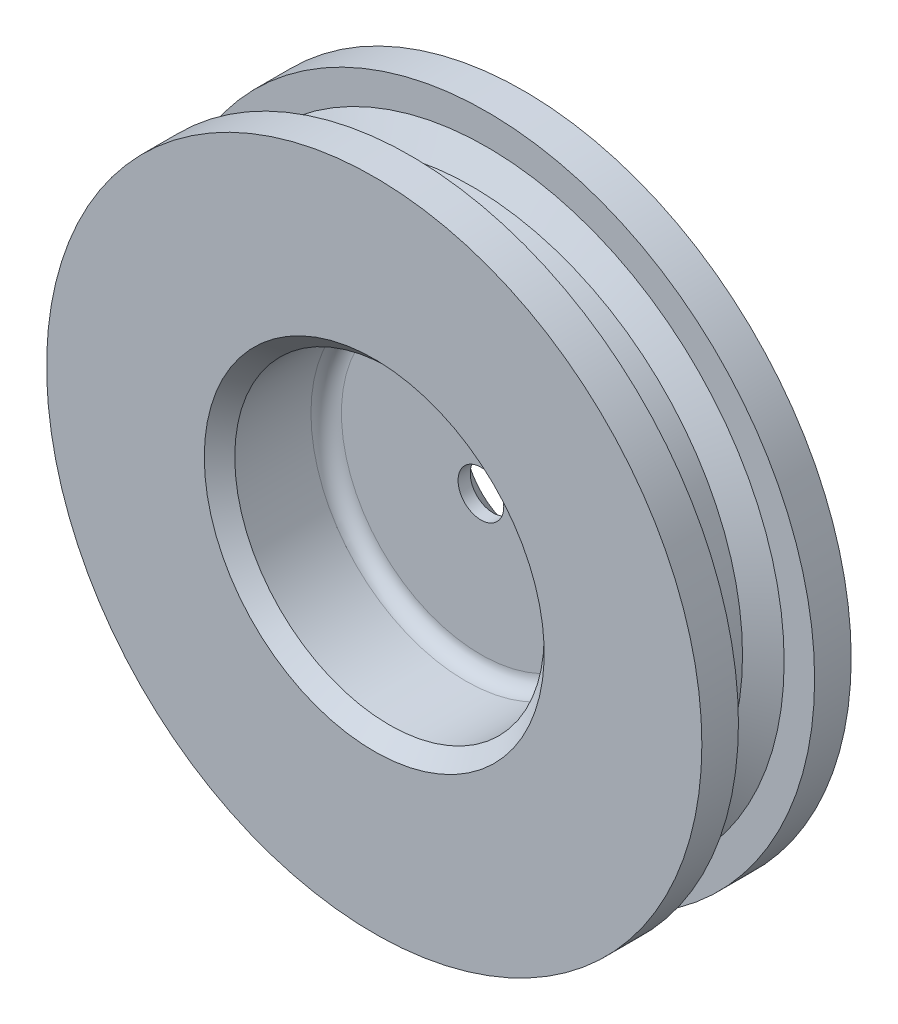
ISO-10303-21;
HEADER;
FILE_DESCRIPTION(('STEP AP214'),'2;1');
FILE_NAME('part.step','',(''),(''),'','','');
FILE_SCHEMA(('AUTOMOTIVE_DESIGN { 1 0 10303 214 1 1 1 1 }'));
ENDSEC;
DATA;
#1=APPLICATION_CONTEXT('core data for automotive mechanical design processes');
#2=APPLICATION_PROTOCOL_DEFINITION('international standard','automotive_design',2000,#1);
#3=PRODUCT_CONTEXT('',#1,'mechanical');
#4=PRODUCT('Part','Part','',(#3));
#5=PRODUCT_RELATED_PRODUCT_CATEGORY('part','',(#4));
#6=PRODUCT_DEFINITION_FORMATION('','',#4);
#7=PRODUCT_DEFINITION_CONTEXT('part definition',#1,'design');
#8=PRODUCT_DEFINITION('design','',#6,#7);
#9=PRODUCT_DEFINITION_SHAPE('','',#8);
#10=(LENGTH_UNIT() NAMED_UNIT(*) SI_UNIT(.MILLI.,.METRE.));
#11=(NAMED_UNIT(*) PLANE_ANGLE_UNIT() SI_UNIT($,.RADIAN.));
#12=(NAMED_UNIT(*) SI_UNIT($,.STERADIAN.) SOLID_ANGLE_UNIT());
#13=UNCERTAINTY_MEASURE_WITH_UNIT(LENGTH_MEASURE(1.E-05),#10,'distance_accuracy_value','');
#14=(GEOMETRIC_REPRESENTATION_CONTEXT(3) GLOBAL_UNCERTAINTY_ASSIGNED_CONTEXT((#13)) GLOBAL_UNIT_ASSIGNED_CONTEXT((#10,
#11,#12)) REPRESENTATION_CONTEXT('',''));
#15=CARTESIAN_POINT('',(0.,0.,0.));
#16=DIRECTION('',(0.,0.,1.));
#17=DIRECTION('',(1.,0.,0.));
#18=AXIS2_PLACEMENT_3D('',#15,#16,#17);
#19=CARTESIAN_POINT('',(0.,-1.5,9.05826702392601));
#20=DIRECTION('',(0.,0.,1.));
#21=DIRECTION('',(1.,0.,0.));
#22=AXIS2_PLACEMENT_3D('',#19,#20,#21);
#23=CYLINDRICAL_SURFACE('',#22,1.5);
#24=CARTESIAN_POINT('',(0.,-1.5,-2.89999999999999));
#25=DIRECTION('',(0.,0.,1.));
#26=DIRECTION('',(1.,0.,0.));
#27=AXIS2_PLACEMENT_3D('',#24,#25,#26);
#28=CIRCLE('',#27,1.5);
#29=CARTESIAN_POINT('',(1.5,-1.5,-2.89999999999999));
#30=VERTEX_POINT('',#29);
#31=EDGE_CURVE('E10',#30,#30,#28,.F.);
#32=ORIENTED_EDGE('',*,*,#31,.T.);
#33=EDGE_LOOP('',(#32));
#34=FACE_BOUND('',#33,.T.);
#35=CARTESIAN_POINT('',(0.,-1.5,-2.1));
#36=DIRECTION('',(0.,0.,1.));
#37=DIRECTION('',(1.,0.,0.));
#38=AXIS2_PLACEMENT_3D('',#35,#36,#37);
#39=CIRCLE('',#38,1.5);
#40=CARTESIAN_POINT('',(1.5,-1.5,-2.1));
#41=VERTEX_POINT('',#40);
#42=EDGE_CURVE('E77',#41,#41,#39,.F.);
#43=ORIENTED_EDGE('',*,*,#42,.F.);
#44=EDGE_LOOP('',(#43));
#45=FACE_BOUND('',#44,.T.);
#46=ADVANCED_FACE('F43',(#34,#45),#23,.F.);
#47=CARTESIAN_POINT('',(0.,0.,4.9));
#48=DIRECTION('',(0.,0.,-1.));
#49=DIRECTION('',(-1.,0.,0.));
#50=AXIS2_PLACEMENT_3D('',#47,#48,#49);
#51=PLANE('',#50);
#52=CARTESIAN_POINT('',(0.,-1.5,4.9));
#53=DIRECTION('',(0.,0.,-1.));
#54=DIRECTION('',(-1.,0.,0.));
#55=AXIS2_PLACEMENT_3D('',#52,#53,#54);
#56=CIRCLE('',#55,11.1538993275223);
#57=CARTESIAN_POINT('',(-11.1538993275223,-1.5,4.9));
#58=VERTEX_POINT('',#57);
#59=EDGE_CURVE('E68',#58,#58,#56,.T.);
#60=ORIENTED_EDGE('',*,*,#59,.T.);
#61=EDGE_LOOP('',(#60));
#62=FACE_BOUND('',#61,.T.);
#63=CARTESIAN_POINT('',(0.,-1.5,4.9));
#64=DIRECTION('',(0.,0.,1.));
#65=DIRECTION('',(1.,0.,0.));
#66=AXIS2_PLACEMENT_3D('',#63,#64,#65);
#67=CIRCLE('',#66,21.5);
#68=CARTESIAN_POINT('',(21.5,-1.5,4.9));
#69=VERTEX_POINT('',#68);
#70=EDGE_CURVE('E76',#69,#69,#67,.T.);
#71=ORIENTED_EDGE('',*,*,#70,.T.);
#72=EDGE_LOOP('',(#71));
#73=FACE_BOUND('',#72,.T.);
#74=ADVANCED_FACE('F131',(#62,#73),#51,.F.);
#75=CARTESIAN_POINT('',(0.,-1.5,9.05826702392601));
#76=DIRECTION('',(0.,0.,1.));
#77=DIRECTION('',(1.,0.,0.));
#78=AXIS2_PLACEMENT_3D('',#75,#76,#77);
#79=CYLINDRICAL_SURFACE('',#78,21.5);
#80=ORIENTED_EDGE('',*,*,#70,.F.);
#81=EDGE_LOOP('',(#80));
#82=FACE_BOUND('',#81,.T.);
#83=CARTESIAN_POINT('',(0.,-1.5,2.5));
#84=DIRECTION('',(0.,0.,1.));
#85=DIRECTION('',(1.,0.,0.));
#86=AXIS2_PLACEMENT_3D('',#83,#84,#85);
#87=CIRCLE('',#86,21.5);
#88=CARTESIAN_POINT('',(21.5,-1.5,2.5));
#89=VERTEX_POINT('',#88);
#90=EDGE_CURVE('E85',#89,#89,#87,.T.);
#91=ORIENTED_EDGE('',*,*,#90,.T.);
#92=EDGE_LOOP('',(#91));
#93=FACE_BOUND('',#92,.T.);
#94=ADVANCED_FACE('F136',(#82,#93),#79,.T.);
#95=CARTESIAN_POINT('',(0.,20.,2.5));
#96=DIRECTION('',(0.,0.,1.));
#97=DIRECTION('',(1.,0.,0.));
#98=AXIS2_PLACEMENT_3D('',#95,#96,#97);
#99=PLANE('',#98);
#100=ORIENTED_EDGE('',*,*,#90,.F.);
#101=EDGE_LOOP('',(#100));
#102=FACE_BOUND('',#101,.T.);
#103=CARTESIAN_POINT('',(0.,-1.5,2.5));
#104=DIRECTION('',(0.,0.,1.));
#105=DIRECTION('',(1.,0.,0.));
#106=AXIS2_PLACEMENT_3D('',#103,#104,#105);
#107=CIRCLE('',#106,19.5);
#108=CARTESIAN_POINT('',(19.5,-1.5,2.5));
#109=VERTEX_POINT('',#108);
#110=EDGE_CURVE('E89',#109,#109,#107,.T.);
#111=ORIENTED_EDGE('',*,*,#110,.T.);
#112=EDGE_LOOP('',(#111));
#113=FACE_BOUND('',#112,.T.);
#114=ADVANCED_FACE('F259',(#102,#113),#99,.F.);
#115=CARTESIAN_POINT('',(0.,-1.5,1.5));
#116=DIRECTION('',(0.,0.,1.));
#117=DIRECTION('',(1.,0.,0.));
#118=AXIS2_PLACEMENT_3D('',#115,#116,#117);
#119=CONICAL_SURFACE('',#118,17.7679491924311,1.0471975511966);
#120=ORIENTED_EDGE('',*,*,#110,.F.);
#121=EDGE_LOOP('',(#120));
#122=FACE_BOUND('',#121,.T.);
#123=CARTESIAN_POINT('',(0.,-1.5,1.5));
#124=DIRECTION('',(0.,0.,1.));
#125=DIRECTION('',(1.,0.,0.));
#126=AXIS2_PLACEMENT_3D('',#123,#124,#125);
#127=CIRCLE('',#126,17.7679491924311);
#128=CARTESIAN_POINT('',(17.7679491924311,-1.5,1.5));
#129=VERTEX_POINT('',#128);
#130=EDGE_CURVE('E93',#129,#129,#127,.T.);
#131=ORIENTED_EDGE('',*,*,#130,.T.);
#132=EDGE_LOOP('',(#131));
#133=FACE_BOUND('',#132,.T.);
#134=ADVANCED_FACE('F250',(#122,#133),#119,.T.);
#135=CARTESIAN_POINT('',(0.,-1.5,9.05826702392601));
#136=DIRECTION('',(0.,0.,1.));
#137=DIRECTION('',(1.,0.,0.));
#138=AXIS2_PLACEMENT_3D('',#135,#136,#137);
#139=CYLINDRICAL_SURFACE('',#138,17.7679491924311);
#140=ORIENTED_EDGE('',*,*,#130,.F.);
#141=EDGE_LOOP('',(#140));
#142=FACE_BOUND('',#141,.T.);
#143=CARTESIAN_POINT('',(0.,-1.5,-1.5));
#144=DIRECTION('',(0.,0.,1.));
#145=DIRECTION('',(1.,0.,0.));
#146=AXIS2_PLACEMENT_3D('',#143,#144,#145);
#147=CIRCLE('',#146,17.7679491924311);
#148=CARTESIAN_POINT('',(17.7679491924311,-1.5,-1.5));
#149=VERTEX_POINT('',#148);
#150=EDGE_CURVE('E97',#149,#149,#147,.T.);
#151=ORIENTED_EDGE('',*,*,#150,.T.);
#152=EDGE_LOOP('',(#151));
#153=FACE_BOUND('',#152,.T.);
#154=ADVANCED_FACE('F239',(#142,#153),#139,.T.);
#155=CARTESIAN_POINT('',(0.,-1.5,-2.5));
#156=DIRECTION('',(0.,0.,-1.));
#157=DIRECTION('',(-1.,0.,0.));
#158=AXIS2_PLACEMENT_3D('',#155,#156,#157);
#159=CONICAL_SURFACE('',#158,19.5,1.0471975511966);
#160=ORIENTED_EDGE('',*,*,#150,.F.);
#161=EDGE_LOOP('',(#160));
#162=FACE_BOUND('',#161,.T.);
#163=CARTESIAN_POINT('',(0.,-1.5,-2.5));
#164=DIRECTION('',(0.,0.,1.));
#165=DIRECTION('',(1.,0.,0.));
#166=AXIS2_PLACEMENT_3D('',#163,#164,#165);
#167=CIRCLE('',#166,19.5);
#168=CARTESIAN_POINT('',(19.5,-1.5,-2.5));
#169=VERTEX_POINT('',#168);
#170=EDGE_CURVE('E101',#169,#169,#167,.T.);
#171=ORIENTED_EDGE('',*,*,#170,.T.);
#172=EDGE_LOOP('',(#171));
#173=FACE_BOUND('',#172,.T.);
#174=ADVANCED_FACE('F229',(#162,#173),#159,.T.);
#175=CARTESIAN_POINT('',(0.,20.,-2.5));
#176=DIRECTION('',(0.,0.,-1.));
#177=DIRECTION('',(-1.,0.,0.));
#178=AXIS2_PLACEMENT_3D('',#175,#176,#177);
#179=PLANE('',#178);
#180=ORIENTED_EDGE('',*,*,#170,.F.);
#181=EDGE_LOOP('',(#180));
#182=FACE_BOUND('',#181,.T.);
#183=CARTESIAN_POINT('',(0.,-1.5,-2.5));
#184=DIRECTION('',(0.,0.,1.));
#185=DIRECTION('',(1.,0.,0.));
#186=AXIS2_PLACEMENT_3D('',#183,#184,#185);
#187=CIRCLE('',#186,21.5);
#188=CARTESIAN_POINT('',(21.5,-1.5,-2.5));
#189=VERTEX_POINT('',#188);
#190=EDGE_CURVE('E105',#189,#189,#187,.T.);
#191=ORIENTED_EDGE('',*,*,#190,.T.);
#192=EDGE_LOOP('',(#191));
#193=FACE_BOUND('',#192,.T.);
#194=ADVANCED_FACE('F126',(#182,#193),#179,.F.);
#195=CARTESIAN_POINT('',(0.,-1.5,9.05826702392601));
#196=DIRECTION('',(0.,0.,1.));
#197=DIRECTION('',(1.,0.,0.));
#198=AXIS2_PLACEMENT_3D('',#195,#196,#197);
#199=CYLINDRICAL_SURFACE('',#198,21.5);
#200=ORIENTED_EDGE('',*,*,#190,.F.);
#201=EDGE_LOOP('',(#200));
#202=FACE_BOUND('',#201,.T.);
#203=CARTESIAN_POINT('',(0.,-1.5,-4.9));
#204=DIRECTION('',(0.,0.,1.));
#205=DIRECTION('',(1.,0.,0.));
#206=AXIS2_PLACEMENT_3D('',#203,#204,#205);
#207=CIRCLE('',#206,21.5);
#208=CARTESIAN_POINT('',(21.5,-1.5,-4.9));
#209=VERTEX_POINT('',#208);
#210=EDGE_CURVE('E81',#209,#209,#207,.T.);
#211=ORIENTED_EDGE('',*,*,#210,.T.);
#212=EDGE_LOOP('',(#211));
#213=FACE_BOUND('',#212,.T.);
#214=ADVANCED_FACE('F113',(#202,#213),#199,.T.);
#215=CARTESIAN_POINT('',(0.,0.,-4.9));
#216=DIRECTION('',(0.,0.,1.));
#217=DIRECTION('',(1.,0.,0.));
#218=AXIS2_PLACEMENT_3D('',#215,#216,#217);
#219=PLANE('',#218);
#220=CARTESIAN_POINT('',(0.,-1.5,-4.9));
#221=DIRECTION('',(0.,0.,1.));
#222=DIRECTION('',(1.,0.,0.));
#223=AXIS2_PLACEMENT_3D('',#220,#221,#222);
#224=CIRCLE('',#223,3.88350718518843);
#225=CARTESIAN_POINT('',(3.88350718518843,-1.5,-4.9));
#226=VERTEX_POINT('',#225);
#227=EDGE_CURVE('E52',#226,#226,#224,.T.);
#228=ORIENTED_EDGE('',*,*,#227,.T.);
#229=EDGE_LOOP('',(#228));
#230=FACE_BOUND('',#229,.T.);
#231=ORIENTED_EDGE('',*,*,#210,.F.);
#232=EDGE_LOOP('',(#231));
#233=FACE_BOUND('',#232,.T.);
#234=ADVANCED_FACE('F115',(#230,#233),#219,.F.);
#235=CARTESIAN_POINT('',(0.,-1.5,-2.1));
#236=DIRECTION('',(0.,0.,1.));
#237=DIRECTION('',(1.,0.,0.));
#238=AXIS2_PLACEMENT_3D('',#235,#236,#237);
#239=PLANE('',#238);
#240=CARTESIAN_POINT('',(0.,-1.5,-2.1));
#241=DIRECTION('',(0.,0.,1.));
#242=DIRECTION('',(1.,0.,0.));
#243=AXIS2_PLACEMENT_3D('',#240,#241,#242);
#244=CIRCLE('',#243,9.15389932752228);
#245=CARTESIAN_POINT('',(9.15389932752228,-1.5,-2.1));
#246=VERTEX_POINT('',#245);
#247=EDGE_CURVE('E62',#246,#246,#244,.T.);
#248=ORIENTED_EDGE('',*,*,#247,.T.);
#249=EDGE_LOOP('',(#248));
#250=FACE_BOUND('',#249,.T.);
#251=ORIENTED_EDGE('',*,*,#42,.T.);
#252=EDGE_LOOP('',(#251));
#253=FACE_BOUND('',#252,.T.);
#254=ADVANCED_FACE('F117',(#250,#253),#239,.T.);
#255=CARTESIAN_POINT('',(0.,-1.5,-2.1));
#256=DIRECTION('',(0.,0.,1.));
#257=DIRECTION('',(1.,0.,0.));
#258=AXIS2_PLACEMENT_3D('',#255,#256,#257);
#259=CYLINDRICAL_SURFACE('',#258,10.1538993275223);
#260=CARTESIAN_POINT('',(0.,-1.5,-1.1));
#261=DIRECTION('',(0.,0.,1.));
#262=DIRECTION('',(1.,0.,0.));
#263=AXIS2_PLACEMENT_3D('',#260,#261,#262);
#264=CIRCLE('',#263,10.1538993275223);
#265=CARTESIAN_POINT('',(10.1538993275223,-1.5,-1.1));
#266=VERTEX_POINT('',#265);
#267=EDGE_CURVE('E57',#266,#266,#264,.F.);
#268=ORIENTED_EDGE('',*,*,#267,.T.);
#269=EDGE_LOOP('',(#268));
#270=FACE_BOUND('',#269,.T.);
#271=CARTESIAN_POINT('',(0.,-1.5,3.90000000000002));
#272=DIRECTION('',(0.,0.,-1.));
#273=DIRECTION('',(-1.,0.,0.));
#274=AXIS2_PLACEMENT_3D('',#271,#272,#273);
#275=CIRCLE('',#274,10.1538993275223);
#276=CARTESIAN_POINT('',(-10.1538993275223,-1.5,3.90000000000002));
#277=VERTEX_POINT('',#276);
#278=EDGE_CURVE('E72',#277,#277,#275,.F.);
#279=ORIENTED_EDGE('',*,*,#278,.T.);
#280=EDGE_LOOP('',(#279));
#281=FACE_BOUND('',#280,.T.);
#282=ADVANCED_FACE('F123',(#270,#281),#259,.F.);
#283=CARTESIAN_POINT('',(0.,-1.5,3.90000000000002));
#284=DIRECTION('',(0.,0.,1.));
#285=DIRECTION('',(1.,0.,0.));
#286=AXIS2_PLACEMENT_3D('',#283,#284,#285);
#287=CONICAL_SURFACE('',#286,10.1538993275223,0.785398163397452);
#288=ORIENTED_EDGE('',*,*,#59,.F.);
#289=EDGE_LOOP('',(#288));
#290=FACE_BOUND('',#289,.T.);
#291=ORIENTED_EDGE('',*,*,#278,.F.);
#292=EDGE_LOOP('',(#291));
#293=FACE_BOUND('',#292,.T.);
#294=ADVANCED_FACE('F143',(#290,#293),#287,.F.);
#295=CARTESIAN_POINT('',(0.,-1.5,-1.1));
#296=DIRECTION('',(0.,0.,1.));
#297=DIRECTION('',(1.,0.,0.));
#298=AXIS2_PLACEMENT_3D('',#295,#296,#297);
#299=TOROIDAL_SURFACE('',#298,9.15389932752228,1.);
#300=ORIENTED_EDGE('',*,*,#267,.F.);
#301=EDGE_LOOP('',(#300));
#302=FACE_BOUND('',#301,.T.);
#303=ORIENTED_EDGE('',*,*,#247,.F.);
#304=EDGE_LOOP('',(#303));
#305=FACE_BOUND('',#304,.T.);
#306=ADVANCED_FACE('F147',(#302,#305),#299,.F.);
#307=CARTESIAN_POINT('',(0.,-1.5,-4.9));
#308=DIRECTION('',(0.,0.,-1.));
#309=DIRECTION('',(-1.,0.,0.));
#310=AXIS2_PLACEMENT_3D('',#307,#308,#309);
#311=CONICAL_SURFACE('',#310,3.88350718518843,0.872664625997163);
#312=ORIENTED_EDGE('',*,*,#31,.F.);
#313=EDGE_LOOP('',(#312));
#314=FACE_BOUND('',#313,.T.);
#315=ORIENTED_EDGE('',*,*,#227,.F.);
#316=EDGE_LOOP('',(#315));
#317=FACE_BOUND('',#316,.T.);
#318=ADVANCED_FACE('F46',(#314,#317),#311,.F.);
#319=CLOSED_SHELL('',(#46,#74,#94,#114,#134,#154,#174,#194,#214,#234,#254,#282,#294,#306,#318));
#320=MANIFOLD_SOLID_BREP('B2',#319);
#321=ADVANCED_BREP_SHAPE_REPRESENTATION('',(#18,#320),#14);
#322=SHAPE_DEFINITION_REPRESENTATION(#9,#321);
ENDSEC;
END-ISO-10303-21;
